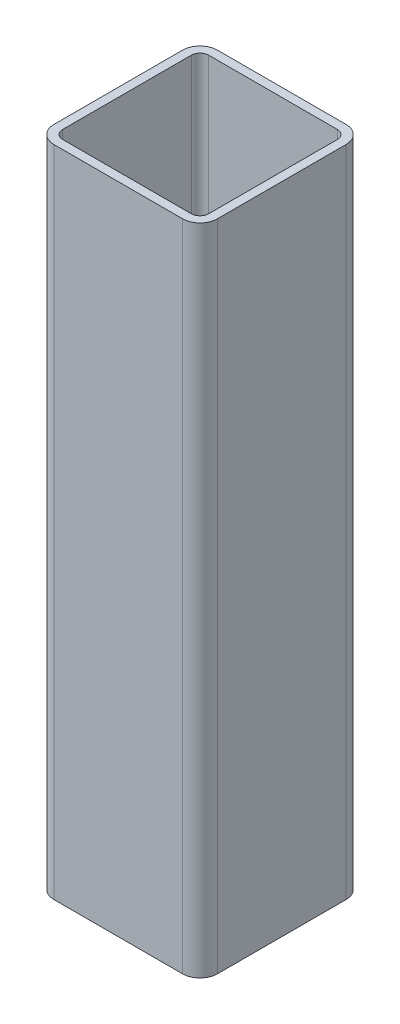
ISO-10303-21;
HEADER;
FILE_DESCRIPTION(('STEP AP214'),'2;1');
FILE_NAME('part.step','',(''),(''),'','','');
FILE_SCHEMA(('AUTOMOTIVE_DESIGN { 1 0 10303 214 1 1 1 1 }'));
ENDSEC;
DATA;
#1=APPLICATION_CONTEXT('core data for automotive mechanical design processes');
#2=APPLICATION_PROTOCOL_DEFINITION('international standard','automotive_design',2000,#1);
#3=PRODUCT_CONTEXT('',#1,'mechanical');
#4=PRODUCT('Part','Part','',(#3));
#5=PRODUCT_RELATED_PRODUCT_CATEGORY('part','',(#4));
#6=PRODUCT_DEFINITION_FORMATION('','',#4);
#7=PRODUCT_DEFINITION_CONTEXT('part definition',#1,'design');
#8=PRODUCT_DEFINITION('design','',#6,#7);
#9=PRODUCT_DEFINITION_SHAPE('','',#8);
#10=(LENGTH_UNIT() NAMED_UNIT(*) SI_UNIT(.MILLI.,.METRE.));
#11=(NAMED_UNIT(*) PLANE_ANGLE_UNIT() SI_UNIT($,.RADIAN.));
#12=(NAMED_UNIT(*) SI_UNIT($,.STERADIAN.) SOLID_ANGLE_UNIT());
#13=UNCERTAINTY_MEASURE_WITH_UNIT(LENGTH_MEASURE(1.E-05),#10,'distance_accuracy_value','');
#14=(GEOMETRIC_REPRESENTATION_CONTEXT(3) GLOBAL_UNCERTAINTY_ASSIGNED_CONTEXT((#13)) GLOBAL_UNIT_ASSIGNED_CONTEXT((#10,
#11,#12)) REPRESENTATION_CONTEXT('',''));
#15=CARTESIAN_POINT('',(0.,0.,0.));
#16=DIRECTION('',(0.,0.,1.));
#17=DIRECTION('',(1.,0.,0.));
#18=AXIS2_PLACEMENT_3D('',#15,#16,#17);
#19=CARTESIAN_POINT('',(646.4,0.,-436.8));
#20=DIRECTION('',(0.,0.,1.));
#21=DIRECTION('',(1.,0.,0.));
#22=AXIS2_PLACEMENT_3D('',#19,#20,#21);
#23=PLANE('',#22);
#24=DIRECTION('',(0.,1.,0.));
#25=VECTOR('',#24,1.);
#26=CARTESIAN_POINT('',(693.6,0.,-436.8));
#27=LINE('',#26,#25);
#28=CARTESIAN_POINT('',(693.6,30.,-436.8));
#29=VERTEX_POINT('',#28);
#30=CARTESIAN_POINT('',(693.6,270.,-436.8));
#31=VERTEX_POINT('',#30);
#32=EDGE_CURVE('E149',#29,#31,#27,.T.);
#33=ORIENTED_EDGE('',*,*,#32,.T.);
#34=DIRECTION('',(-1.,0.,0.));
#35=VECTOR('',#34,1.);
#36=CARTESIAN_POINT('',(646.4,270.,-436.8));
#37=LINE('',#36,#35);
#38=CARTESIAN_POINT('',(646.4,270.,-436.8));
#39=VERTEX_POINT('',#38);
#40=EDGE_CURVE('E181',#39,#31,#37,.F.);
#41=ORIENTED_EDGE('',*,*,#40,.F.);
#42=DIRECTION('',(0.,1.,0.));
#43=VECTOR('',#42,1.);
#44=CARTESIAN_POINT('',(646.4,0.,-436.8));
#45=LINE('',#44,#43);
#46=CARTESIAN_POINT('',(646.4,30.,-436.8));
#47=VERTEX_POINT('',#46);
#48=EDGE_CURVE('E152',#39,#47,#45,.F.);
#49=ORIENTED_EDGE('',*,*,#48,.T.);
#50=DIRECTION('',(1.,0.,0.));
#51=VECTOR('',#50,1.);
#52=CARTESIAN_POINT('',(670.,30.,-436.8));
#53=LINE('',#52,#51);
#54=EDGE_CURVE('E200',#29,#47,#53,.F.);
#55=ORIENTED_EDGE('',*,*,#54,.F.);
#56=EDGE_LOOP('',(#33,#41,#49,#55));
#57=FACE_BOUND('',#56,.T.);
#58=ADVANCED_FACE('F16',(#57),#23,.T.);
#59=CARTESIAN_POINT('',(693.6,0.,-433.6));
#60=DIRECTION('',(0.,1.,0.));
#61=DIRECTION('',(0.,0.,1.));
#62=AXIS2_PLACEMENT_3D('',#59,#60,#61);
#63=CYLINDRICAL_SURFACE('',#62,3.19999999999998);
#64=CARTESIAN_POINT('',(693.6,30.,-433.6));
#65=DIRECTION('',(0.,1.,0.));
#66=DIRECTION('',(0.,0.,1.));
#67=AXIS2_PLACEMENT_3D('',#64,#65,#66);
#68=CIRCLE('',#67,3.19999999999998);
#69=CARTESIAN_POINT('',(696.8,30.,-433.6));
#70=VERTEX_POINT('',#69);
#71=EDGE_CURVE('E115',#70,#29,#68,.T.);
#72=ORIENTED_EDGE('',*,*,#71,.F.);
#73=DIRECTION('',(0.,1.,0.));
#74=VECTOR('',#73,1.);
#75=CARTESIAN_POINT('',(696.8,0.,-433.6));
#76=LINE('',#75,#74);
#77=CARTESIAN_POINT('',(696.8,270.,-433.6));
#78=VERTEX_POINT('',#77);
#79=EDGE_CURVE('E106',#78,#70,#76,.F.);
#80=ORIENTED_EDGE('',*,*,#79,.F.);
#81=CARTESIAN_POINT('',(693.6,270.,-433.6));
#82=DIRECTION('',(0.,1.,0.));
#83=DIRECTION('',(0.,0.,1.));
#84=AXIS2_PLACEMENT_3D('',#81,#82,#83);
#85=CIRCLE('',#84,3.19999999999998);
#86=EDGE_CURVE('E178',#31,#78,#85,.F.);
#87=ORIENTED_EDGE('',*,*,#86,.F.);
#88=ORIENTED_EDGE('',*,*,#32,.F.);
#89=EDGE_LOOP('',(#72,#80,#87,#88));
#90=FACE_BOUND('',#89,.T.);
#91=ADVANCED_FACE('F275',(#90),#63,.F.);
#92=CARTESIAN_POINT('',(696.8,0.,-386.4));
#93=DIRECTION('',(-1.,0.,0.));
#94=DIRECTION('',(0.,0.,1.));
#95=AXIS2_PLACEMENT_3D('',#92,#93,#94);
#96=PLANE('',#95);
#97=DIRECTION('',(0.,1.,0.));
#98=VECTOR('',#97,1.);
#99=CARTESIAN_POINT('',(696.8,0.,-386.4));
#100=LINE('',#99,#98);
#101=CARTESIAN_POINT('',(696.8,30.,-386.4));
#102=VERTEX_POINT('',#101);
#103=CARTESIAN_POINT('',(696.8,270.,-386.4));
#104=VERTEX_POINT('',#103);
#105=EDGE_CURVE('E95',#102,#104,#100,.T.);
#106=ORIENTED_EDGE('',*,*,#105,.T.);
#107=DIRECTION('',(0.,0.,1.));
#108=VECTOR('',#107,1.);
#109=CARTESIAN_POINT('',(696.8,270.,1170.));
#110=LINE('',#109,#108);
#111=EDGE_CURVE('E177',#78,#104,#110,.T.);
#112=ORIENTED_EDGE('',*,*,#111,.F.);
#113=ORIENTED_EDGE('',*,*,#79,.T.);
#114=DIRECTION('',(0.,0.,-1.));
#115=VECTOR('',#114,1.);
#116=CARTESIAN_POINT('',(696.8,30.,-433.6));
#117=LINE('',#116,#115);
#118=EDGE_CURVE('E109',#102,#70,#117,.T.);
#119=ORIENTED_EDGE('',*,*,#118,.F.);
#120=EDGE_LOOP('',(#106,#112,#113,#119));
#121=FACE_BOUND('',#120,.T.);
#122=ADVANCED_FACE('F110',(#121),#96,.T.);
#123=CARTESIAN_POINT('',(693.6,0.,-386.4));
#124=DIRECTION('',(0.,1.,0.));
#125=DIRECTION('',(0.,0.,1.));
#126=AXIS2_PLACEMENT_3D('',#123,#124,#125);
#127=CYLINDRICAL_SURFACE('',#126,3.19999999999998);
#128=CARTESIAN_POINT('',(693.6,30.,-386.4));
#129=DIRECTION('',(0.,1.,0.));
#130=DIRECTION('',(0.,0.,1.));
#131=AXIS2_PLACEMENT_3D('',#128,#129,#130);
#132=CIRCLE('',#131,3.19999999999998);
#133=CARTESIAN_POINT('',(693.6,30.,-383.2));
#134=VERTEX_POINT('',#133);
#135=EDGE_CURVE('E19',#134,#102,#132,.T.);
#136=ORIENTED_EDGE('',*,*,#135,.F.);
#137=DIRECTION('',(0.,1.,0.));
#138=VECTOR('',#137,1.);
#139=CARTESIAN_POINT('',(693.6,0.,-383.2));
#140=LINE('',#139,#138);
#141=CARTESIAN_POINT('',(693.6,270.,-383.2));
#142=VERTEX_POINT('',#141);
#143=EDGE_CURVE('E89',#142,#134,#140,.F.);
#144=ORIENTED_EDGE('',*,*,#143,.F.);
#145=CARTESIAN_POINT('',(693.6,270.,-386.4));
#146=DIRECTION('',(0.,1.,0.));
#147=DIRECTION('',(0.,0.,1.));
#148=AXIS2_PLACEMENT_3D('',#145,#146,#147);
#149=CIRCLE('',#148,3.19999999999998);
#150=EDGE_CURVE('E102',#104,#142,#149,.F.);
#151=ORIENTED_EDGE('',*,*,#150,.F.);
#152=ORIENTED_EDGE('',*,*,#105,.F.);
#153=EDGE_LOOP('',(#136,#144,#151,#152));
#154=FACE_BOUND('',#153,.T.);
#155=ADVANCED_FACE('F97',(#154),#127,.F.);
#156=CARTESIAN_POINT('',(693.6,0.,-383.2));
#157=DIRECTION('',(0.,0.,-1.));
#158=DIRECTION('',(-1.,0.,0.));
#159=AXIS2_PLACEMENT_3D('',#156,#157,#158);
#160=PLANE('',#159);
#161=DIRECTION('',(0.,1.,0.));
#162=VECTOR('',#161,1.);
#163=CARTESIAN_POINT('',(646.4,0.,-383.2));
#164=LINE('',#163,#162);
#165=CARTESIAN_POINT('',(646.4,30.,-383.2));
#166=VERTEX_POINT('',#165);
#167=CARTESIAN_POINT('',(646.4,270.,-383.2));
#168=VERTEX_POINT('',#167);
#169=EDGE_CURVE('E121',#166,#168,#164,.T.);
#170=ORIENTED_EDGE('',*,*,#169,.T.);
#171=DIRECTION('',(-1.,0.,0.));
#172=VECTOR('',#171,1.);
#173=CARTESIAN_POINT('',(646.4,270.,-383.2));
#174=LINE('',#173,#172);
#175=EDGE_CURVE('E175',#142,#168,#174,.T.);
#176=ORIENTED_EDGE('',*,*,#175,.F.);
#177=ORIENTED_EDGE('',*,*,#143,.T.);
#178=DIRECTION('',(1.,0.,0.));
#179=VECTOR('',#178,1.);
#180=CARTESIAN_POINT('',(670.,30.,-383.2));
#181=LINE('',#180,#179);
#182=EDGE_CURVE('E120',#166,#134,#181,.T.);
#183=ORIENTED_EDGE('',*,*,#182,.F.);
#184=EDGE_LOOP('',(#170,#176,#177,#183));
#185=FACE_BOUND('',#184,.T.);
#186=ADVANCED_FACE('F283',(#185),#160,.T.);
#187=CARTESIAN_POINT('',(693.6,0.,-386.4));
#188=DIRECTION('',(0.,1.,0.));
#189=DIRECTION('',(0.,0.,1.));
#190=AXIS2_PLACEMENT_3D('',#187,#188,#189);
#191=CYLINDRICAL_SURFACE('',#190,6.40000000000002);
#192=CARTESIAN_POINT('',(693.6,270.,-386.4));
#193=DIRECTION('',(0.,1.,0.));
#194=DIRECTION('',(0.,0.,1.));
#195=AXIS2_PLACEMENT_3D('',#192,#193,#194);
#196=CIRCLE('',#195,6.40000000000002);
#197=CARTESIAN_POINT('',(693.6,270.,-380.));
#198=VERTEX_POINT('',#197);
#199=CARTESIAN_POINT('',(700.,270.,-386.4));
#200=VERTEX_POINT('',#199);
#201=EDGE_CURVE('E169',#198,#200,#196,.T.);
#202=ORIENTED_EDGE('',*,*,#201,.F.);
#203=DIRECTION('',(0.,1.,0.));
#204=VECTOR('',#203,1.);
#205=CARTESIAN_POINT('',(693.6,0.,-380.));
#206=LINE('',#205,#204);
#207=CARTESIAN_POINT('',(693.6,30.,-380.));
#208=VERTEX_POINT('',#207);
#209=EDGE_CURVE('E124',#198,#208,#206,.F.);
#210=ORIENTED_EDGE('',*,*,#209,.T.);
#211=CARTESIAN_POINT('',(693.6,30.,-386.4));
#212=DIRECTION('',(0.,1.,0.));
#213=DIRECTION('',(0.,0.,1.));
#214=AXIS2_PLACEMENT_3D('',#211,#212,#213);
#215=CIRCLE('',#214,6.40000000000002);
#216=CARTESIAN_POINT('',(700.,30.,-386.4));
#217=VERTEX_POINT('',#216);
#218=EDGE_CURVE('E184',#217,#208,#215,.F.);
#219=ORIENTED_EDGE('',*,*,#218,.F.);
#220=DIRECTION('',(0.,1.,0.));
#221=VECTOR('',#220,1.);
#222=CARTESIAN_POINT('',(700.,0.,-386.4));
#223=LINE('',#222,#221);
#224=EDGE_CURVE('E144',#217,#200,#223,.T.);
#225=ORIENTED_EDGE('',*,*,#224,.T.);
#226=EDGE_LOOP('',(#202,#210,#219,#225));
#227=FACE_BOUND('',#226,.T.);
#228=ADVANCED_FACE('F285',(#227),#191,.T.);
#229=CARTESIAN_POINT('',(700.,0.,-386.4));
#230=DIRECTION('',(-1.,0.,0.));
#231=DIRECTION('',(0.,0.,1.));
#232=AXIS2_PLACEMENT_3D('',#229,#230,#231);
#233=PLANE('',#232);
#234=DIRECTION('',(0.,1.,0.));
#235=VECTOR('',#234,1.);
#236=CARTESIAN_POINT('',(700.,0.,-433.6));
#237=LINE('',#236,#235);
#238=CARTESIAN_POINT('',(700.,270.,-433.6));
#239=VERTEX_POINT('',#238);
#240=CARTESIAN_POINT('',(700.,30.,-433.6));
#241=VERTEX_POINT('',#240);
#242=EDGE_CURVE('E142',#239,#241,#237,.F.);
#243=ORIENTED_EDGE('',*,*,#242,.F.);
#244=DIRECTION('',(0.,0.,1.));
#245=VECTOR('',#244,1.);
#246=CARTESIAN_POINT('',(700.,270.,1170.));
#247=LINE('',#246,#245);
#248=EDGE_CURVE('E168',#200,#239,#247,.F.);
#249=ORIENTED_EDGE('',*,*,#248,.F.);
#250=ORIENTED_EDGE('',*,*,#224,.F.);
#251=DIRECTION('',(0.,0.,-1.));
#252=VECTOR('',#251,1.);
#253=CARTESIAN_POINT('',(700.,30.,-433.6));
#254=LINE('',#253,#252);
#255=EDGE_CURVE('E187',#241,#217,#254,.F.);
#256=ORIENTED_EDGE('',*,*,#255,.F.);
#257=EDGE_LOOP('',(#243,#249,#250,#256));
#258=FACE_BOUND('',#257,.T.);
#259=ADVANCED_FACE('F292',(#258),#233,.F.);
#260=CARTESIAN_POINT('',(693.6,0.,-433.6));
#261=DIRECTION('',(0.,1.,0.));
#262=DIRECTION('',(0.,0.,1.));
#263=AXIS2_PLACEMENT_3D('',#260,#261,#262);
#264=CYLINDRICAL_SURFACE('',#263,6.40000000000002);
#265=CARTESIAN_POINT('',(693.6,270.,-433.6));
#266=DIRECTION('',(0.,1.,0.));
#267=DIRECTION('',(0.,0.,1.));
#268=AXIS2_PLACEMENT_3D('',#265,#266,#267);
#269=CIRCLE('',#268,6.40000000000002);
#270=CARTESIAN_POINT('',(693.6,270.,-440.));
#271=VERTEX_POINT('',#270);
#272=EDGE_CURVE('E165',#239,#271,#269,.T.);
#273=ORIENTED_EDGE('',*,*,#272,.F.);
#274=ORIENTED_EDGE('',*,*,#242,.T.);
#275=CARTESIAN_POINT('',(693.6,30.,-433.6));
#276=DIRECTION('',(0.,1.,0.));
#277=DIRECTION('',(0.,0.,1.));
#278=AXIS2_PLACEMENT_3D('',#275,#276,#277);
#279=CIRCLE('',#278,6.40000000000002);
#280=CARTESIAN_POINT('',(693.6,30.,-440.));
#281=VERTEX_POINT('',#280);
#282=EDGE_CURVE('E188',#281,#241,#279,.F.);
#283=ORIENTED_EDGE('',*,*,#282,.F.);
#284=DIRECTION('',(0.,1.,0.));
#285=VECTOR('',#284,1.);
#286=CARTESIAN_POINT('',(693.6,0.,-440.));
#287=LINE('',#286,#285);
#288=EDGE_CURVE('E139',#281,#271,#287,.T.);
#289=ORIENTED_EDGE('',*,*,#288,.T.);
#290=EDGE_LOOP('',(#273,#274,#283,#289));
#291=FACE_BOUND('',#290,.T.);
#292=ADVANCED_FACE('F326',(#291),#264,.T.);
#293=CARTESIAN_POINT('',(646.4,0.,-440.));
#294=DIRECTION('',(0.,0.,1.));
#295=DIRECTION('',(1.,0.,0.));
#296=AXIS2_PLACEMENT_3D('',#293,#294,#295);
#297=PLANE('',#296);
#298=DIRECTION('',(0.,1.,0.));
#299=VECTOR('',#298,1.);
#300=CARTESIAN_POINT('',(646.4,0.,-440.));
#301=LINE('',#300,#299);
#302=CARTESIAN_POINT('',(646.4,270.,-440.));
#303=VERTEX_POINT('',#302);
#304=CARTESIAN_POINT('',(646.4,30.,-440.));
#305=VERTEX_POINT('',#304);
#306=EDGE_CURVE('E137',#303,#305,#301,.F.);
#307=ORIENTED_EDGE('',*,*,#306,.F.);
#308=DIRECTION('',(-1.,0.,0.));
#309=VECTOR('',#308,1.);
#310=CARTESIAN_POINT('',(646.4,270.,-440.));
#311=LINE('',#310,#309);
#312=EDGE_CURVE('E164',#271,#303,#311,.T.);
#313=ORIENTED_EDGE('',*,*,#312,.F.);
#314=ORIENTED_EDGE('',*,*,#288,.F.);
#315=DIRECTION('',(1.,0.,0.));
#316=VECTOR('',#315,1.);
#317=CARTESIAN_POINT('',(670.,30.,-440.));
#318=LINE('',#317,#316);
#319=EDGE_CURVE('E191',#305,#281,#318,.T.);
#320=ORIENTED_EDGE('',*,*,#319,.F.);
#321=EDGE_LOOP('',(#307,#313,#314,#320));
#322=FACE_BOUND('',#321,.T.);
#323=ADVANCED_FACE('F322',(#322),#297,.F.);
#324=CARTESIAN_POINT('',(646.4,0.,-433.6));
#325=DIRECTION('',(0.,1.,0.));
#326=DIRECTION('',(0.,0.,1.));
#327=AXIS2_PLACEMENT_3D('',#324,#325,#326);
#328=CYLINDRICAL_SURFACE('',#327,6.40000000000002);
#329=CARTESIAN_POINT('',(646.4,270.,-433.6));
#330=DIRECTION('',(0.,1.,0.));
#331=DIRECTION('',(0.,0.,1.));
#332=AXIS2_PLACEMENT_3D('',#329,#330,#331);
#333=CIRCLE('',#332,6.40000000000002);
#334=CARTESIAN_POINT('',(640.,270.,-433.6));
#335=VERTEX_POINT('',#334);
#336=EDGE_CURVE('E161',#303,#335,#333,.T.);
#337=ORIENTED_EDGE('',*,*,#336,.F.);
#338=ORIENTED_EDGE('',*,*,#306,.T.);
#339=CARTESIAN_POINT('',(646.4,30.,-433.6));
#340=DIRECTION('',(0.,1.,0.));
#341=DIRECTION('',(0.,0.,1.));
#342=AXIS2_PLACEMENT_3D('',#339,#340,#341);
#343=CIRCLE('',#342,6.40000000000002);
#344=CARTESIAN_POINT('',(640.,30.,-433.6));
#345=VERTEX_POINT('',#344);
#346=EDGE_CURVE('E192',#345,#305,#343,.F.);
#347=ORIENTED_EDGE('',*,*,#346,.F.);
#348=DIRECTION('',(0.,1.,0.));
#349=VECTOR('',#348,1.);
#350=CARTESIAN_POINT('',(640.,0.,-433.6));
#351=LINE('',#350,#349);
#352=EDGE_CURVE('E134',#345,#335,#351,.T.);
#353=ORIENTED_EDGE('',*,*,#352,.T.);
#354=EDGE_LOOP('',(#337,#338,#347,#353));
#355=FACE_BOUND('',#354,.T.);
#356=ADVANCED_FACE('F318',(#355),#328,.T.);
#357=CARTESIAN_POINT('',(640.,0.,-433.6));
#358=DIRECTION('',(1.,0.,0.));
#359=DIRECTION('',(0.,0.,-1.));
#360=AXIS2_PLACEMENT_3D('',#357,#358,#359);
#361=PLANE('',#360);
#362=DIRECTION('',(0.,1.,0.));
#363=VECTOR('',#362,1.);
#364=CARTESIAN_POINT('',(640.,0.,-386.4));
#365=LINE('',#364,#363);
#366=CARTESIAN_POINT('',(640.,270.,-386.4));
#367=VERTEX_POINT('',#366);
#368=CARTESIAN_POINT('',(640.,30.,-386.4));
#369=VERTEX_POINT('',#368);
#370=EDGE_CURVE('E131',#367,#369,#365,.F.);
#371=ORIENTED_EDGE('',*,*,#370,.F.);
#372=DIRECTION('',(0.,0.,1.));
#373=VECTOR('',#372,1.);
#374=CARTESIAN_POINT('',(640.,270.,1170.));
#375=LINE('',#374,#373);
#376=EDGE_CURVE('E160',#335,#367,#375,.T.);
#377=ORIENTED_EDGE('',*,*,#376,.F.);
#378=ORIENTED_EDGE('',*,*,#352,.F.);
#379=DIRECTION('',(0.,0.,-1.));
#380=VECTOR('',#379,1.);
#381=CARTESIAN_POINT('',(640.,30.,-433.6));
#382=LINE('',#381,#380);
#383=EDGE_CURVE('E195',#369,#345,#382,.T.);
#384=ORIENTED_EDGE('',*,*,#383,.F.);
#385=EDGE_LOOP('',(#371,#377,#378,#384));
#386=FACE_BOUND('',#385,.T.);
#387=ADVANCED_FACE('F315',(#386),#361,.F.);
#388=CARTESIAN_POINT('',(646.4,0.,-386.4));
#389=DIRECTION('',(0.,1.,0.));
#390=DIRECTION('',(0.,0.,1.));
#391=AXIS2_PLACEMENT_3D('',#388,#389,#390);
#392=CYLINDRICAL_SURFACE('',#391,6.40000000000002);
#393=CARTESIAN_POINT('',(646.4,270.,-386.4));
#394=DIRECTION('',(0.,1.,0.));
#395=DIRECTION('',(0.,0.,1.));
#396=AXIS2_PLACEMENT_3D('',#393,#394,#395);
#397=CIRCLE('',#396,6.40000000000002);
#398=CARTESIAN_POINT('',(646.4,270.,-380.));
#399=VERTEX_POINT('',#398);
#400=EDGE_CURVE('E156',#367,#399,#397,.T.);
#401=ORIENTED_EDGE('',*,*,#400,.F.);
#402=ORIENTED_EDGE('',*,*,#370,.T.);
#403=CARTESIAN_POINT('',(646.4,30.,-386.4));
#404=DIRECTION('',(0.,1.,0.));
#405=DIRECTION('',(0.,0.,1.));
#406=AXIS2_PLACEMENT_3D('',#403,#404,#405);
#407=CIRCLE('',#406,6.40000000000002);
#408=CARTESIAN_POINT('',(646.4,30.,-380.));
#409=VERTEX_POINT('',#408);
#410=EDGE_CURVE('E196',#409,#369,#407,.F.);
#411=ORIENTED_EDGE('',*,*,#410,.F.);
#412=DIRECTION('',(0.,1.,0.));
#413=VECTOR('',#412,1.);
#414=CARTESIAN_POINT('',(646.4,0.,-380.));
#415=LINE('',#414,#413);
#416=EDGE_CURVE('E128',#409,#399,#415,.T.);
#417=ORIENTED_EDGE('',*,*,#416,.T.);
#418=EDGE_LOOP('',(#401,#402,#411,#417));
#419=FACE_BOUND('',#418,.T.);
#420=ADVANCED_FACE('F312',(#419),#392,.T.);
#421=CARTESIAN_POINT('',(693.6,0.,-380.));
#422=DIRECTION('',(0.,0.,-1.));
#423=DIRECTION('',(-1.,0.,0.));
#424=AXIS2_PLACEMENT_3D('',#421,#422,#423);
#425=PLANE('',#424);
#426=ORIENTED_EDGE('',*,*,#209,.F.);
#427=DIRECTION('',(-1.,0.,0.));
#428=VECTOR('',#427,1.);
#429=CARTESIAN_POINT('',(646.4,270.,-380.));
#430=LINE('',#429,#428);
#431=EDGE_CURVE('E159',#399,#198,#430,.F.);
#432=ORIENTED_EDGE('',*,*,#431,.F.);
#433=ORIENTED_EDGE('',*,*,#416,.F.);
#434=DIRECTION('',(1.,0.,0.));
#435=VECTOR('',#434,1.);
#436=CARTESIAN_POINT('',(670.,30.,-380.));
#437=LINE('',#436,#435);
#438=EDGE_CURVE('E155',#208,#409,#437,.F.);
#439=ORIENTED_EDGE('',*,*,#438,.F.);
#440=EDGE_LOOP('',(#426,#432,#433,#439));
#441=FACE_BOUND('',#440,.T.);
#442=ADVANCED_FACE('F247',(#441),#425,.F.);
#443=CARTESIAN_POINT('',(646.4,0.,-386.4));
#444=DIRECTION('',(0.,1.,0.));
#445=DIRECTION('',(0.,0.,1.));
#446=AXIS2_PLACEMENT_3D('',#443,#444,#445);
#447=CYLINDRICAL_SURFACE('',#446,3.19999999999998);
#448=CARTESIAN_POINT('',(646.4,30.,-386.4));
#449=DIRECTION('',(0.,1.,0.));
#450=DIRECTION('',(0.,0.,1.));
#451=AXIS2_PLACEMENT_3D('',#448,#449,#450);
#452=CIRCLE('',#451,3.19999999999998);
#453=CARTESIAN_POINT('',(643.2,30.,-386.4));
#454=VERTEX_POINT('',#453);
#455=EDGE_CURVE('E199',#454,#166,#452,.T.);
#456=ORIENTED_EDGE('',*,*,#455,.F.);
#457=DIRECTION('',(0.,1.,0.));
#458=VECTOR('',#457,1.);
#459=CARTESIAN_POINT('',(643.2,0.,-386.4));
#460=LINE('',#459,#458);
#461=CARTESIAN_POINT('',(643.2,270.,-386.4));
#462=VERTEX_POINT('',#461);
#463=EDGE_CURVE('E216',#462,#454,#460,.F.);
#464=ORIENTED_EDGE('',*,*,#463,.F.);
#465=CARTESIAN_POINT('',(646.4,270.,-386.4));
#466=DIRECTION('',(0.,1.,0.));
#467=DIRECTION('',(0.,0.,1.));
#468=AXIS2_PLACEMENT_3D('',#465,#466,#467);
#469=CIRCLE('',#468,3.19999999999998);
#470=EDGE_CURVE('E172',#168,#462,#469,.F.);
#471=ORIENTED_EDGE('',*,*,#470,.F.);
#472=ORIENTED_EDGE('',*,*,#169,.F.);
#473=EDGE_LOOP('',(#456,#464,#471,#472));
#474=FACE_BOUND('',#473,.T.);
#475=ADVANCED_FACE('F281',(#474),#447,.F.);
#476=CARTESIAN_POINT('',(670.,30.,-433.6));
#477=DIRECTION('',(0.,-1.,0.));
#478=DIRECTION('',(0.,0.,-1.));
#479=AXIS2_PLACEMENT_3D('',#476,#477,#478);
#480=PLANE('',#479);
#481=ORIENTED_EDGE('',*,*,#218,.T.);
#482=ORIENTED_EDGE('',*,*,#438,.T.);
#483=ORIENTED_EDGE('',*,*,#410,.T.);
#484=ORIENTED_EDGE('',*,*,#383,.T.);
#485=ORIENTED_EDGE('',*,*,#346,.T.);
#486=ORIENTED_EDGE('',*,*,#319,.T.);
#487=ORIENTED_EDGE('',*,*,#282,.T.);
#488=ORIENTED_EDGE('',*,*,#255,.T.);
#489=EDGE_LOOP('',(#481,#482,#483,#484,#485,#486,#487,#488));
#490=FACE_BOUND('',#489,.T.);
#491=DIRECTION('',(0.,0.,-1.));
#492=VECTOR('',#491,1.);
#493=CARTESIAN_POINT('',(643.2,30.,-433.6));
#494=LINE('',#493,#492);
#495=CARTESIAN_POINT('',(643.2,30.,-433.6));
#496=VERTEX_POINT('',#495);
#497=EDGE_CURVE('E213',#454,#496,#494,.T.);
#498=ORIENTED_EDGE('',*,*,#497,.F.);
#499=ORIENTED_EDGE('',*,*,#455,.T.);
#500=ORIENTED_EDGE('',*,*,#182,.T.);
#501=ORIENTED_EDGE('',*,*,#135,.T.);
#502=ORIENTED_EDGE('',*,*,#118,.T.);
#503=ORIENTED_EDGE('',*,*,#71,.T.);
#504=ORIENTED_EDGE('',*,*,#54,.T.);
#505=CARTESIAN_POINT('',(646.4,30.,-433.6));
#506=DIRECTION('',(0.,1.,0.));
#507=DIRECTION('',(0.,0.,1.));
#508=AXIS2_PLACEMENT_3D('',#505,#506,#507);
#509=CIRCLE('',#508,3.19999999999993);
#510=EDGE_CURVE('E154',#47,#496,#509,.T.);
#511=ORIENTED_EDGE('',*,*,#510,.T.);
#512=EDGE_LOOP('',(#498,#499,#500,#501,#502,#503,#504,#511));
#513=FACE_BOUND('',#512,.T.);
#514=ADVANCED_FACE('F118',(#490,#513),#480,.T.);
#515=CARTESIAN_POINT('',(646.4,0.,-433.6));
#516=DIRECTION('',(0.,1.,0.));
#517=DIRECTION('',(0.,0.,1.));
#518=AXIS2_PLACEMENT_3D('',#515,#516,#517);
#519=CYLINDRICAL_SURFACE('',#518,3.19999999999993);
#520=ORIENTED_EDGE('',*,*,#510,.F.);
#521=ORIENTED_EDGE('',*,*,#48,.F.);
#522=CARTESIAN_POINT('',(646.4,270.,-433.6));
#523=DIRECTION('',(0.,1.,0.));
#524=DIRECTION('',(0.,0.,1.));
#525=AXIS2_PLACEMENT_3D('',#522,#523,#524);
#526=CIRCLE('',#525,3.19999999999993);
#527=CARTESIAN_POINT('',(643.2,270.,-433.6));
#528=VERTEX_POINT('',#527);
#529=EDGE_CURVE('E34',#528,#39,#526,.F.);
#530=ORIENTED_EDGE('',*,*,#529,.F.);
#531=DIRECTION('',(0.,1.,0.));
#532=VECTOR('',#531,1.);
#533=CARTESIAN_POINT('',(643.2,0.,-433.6));
#534=LINE('',#533,#532);
#535=EDGE_CURVE('E25',#496,#528,#534,.T.);
#536=ORIENTED_EDGE('',*,*,#535,.F.);
#537=EDGE_LOOP('',(#520,#521,#530,#536));
#538=FACE_BOUND('',#537,.T.);
#539=ADVANCED_FACE('F276',(#538),#519,.F.);
#540=CARTESIAN_POINT('',(646.4,270.,1170.));
#541=DIRECTION('',(0.,1.,0.));
#542=DIRECTION('',(-1.,0.,0.));
#543=AXIS2_PLACEMENT_3D('',#540,#541,#542);
#544=PLANE('',#543);
#545=ORIENTED_EDGE('',*,*,#400,.T.);
#546=ORIENTED_EDGE('',*,*,#431,.T.);
#547=ORIENTED_EDGE('',*,*,#201,.T.);
#548=ORIENTED_EDGE('',*,*,#248,.T.);
#549=ORIENTED_EDGE('',*,*,#272,.T.);
#550=ORIENTED_EDGE('',*,*,#312,.T.);
#551=ORIENTED_EDGE('',*,*,#336,.T.);
#552=ORIENTED_EDGE('',*,*,#376,.T.);
#553=EDGE_LOOP('',(#545,#546,#547,#548,#549,#550,#551,#552));
#554=FACE_BOUND('',#553,.T.);
#555=ORIENTED_EDGE('',*,*,#175,.T.);
#556=ORIENTED_EDGE('',*,*,#470,.T.);
#557=DIRECTION('',(0.,0.,-1.));
#558=VECTOR('',#557,1.);
#559=CARTESIAN_POINT('',(643.2,270.,-433.6));
#560=LINE('',#559,#558);
#561=EDGE_CURVE('E11',#528,#462,#560,.F.);
#562=ORIENTED_EDGE('',*,*,#561,.F.);
#563=ORIENTED_EDGE('',*,*,#529,.T.);
#564=ORIENTED_EDGE('',*,*,#40,.T.);
#565=ORIENTED_EDGE('',*,*,#86,.T.);
#566=ORIENTED_EDGE('',*,*,#111,.T.);
#567=ORIENTED_EDGE('',*,*,#150,.T.);
#568=EDGE_LOOP('',(#555,#556,#562,#563,#564,#565,#566,#567));
#569=FACE_BOUND('',#568,.T.);
#570=ADVANCED_FACE('F236',(#554,#569),#544,.T.);
#571=CARTESIAN_POINT('',(643.2,0.,-433.6));
#572=DIRECTION('',(1.,0.,0.));
#573=DIRECTION('',(0.,0.,-1.));
#574=AXIS2_PLACEMENT_3D('',#571,#572,#573);
#575=PLANE('',#574);
#576=ORIENTED_EDGE('',*,*,#535,.T.);
#577=ORIENTED_EDGE('',*,*,#561,.T.);
#578=ORIENTED_EDGE('',*,*,#463,.T.);
#579=ORIENTED_EDGE('',*,*,#497,.T.);
#580=EDGE_LOOP('',(#576,#577,#578,#579));
#581=FACE_BOUND('',#580,.T.);
#582=ADVANCED_FACE('F278',(#581),#575,.T.);
#583=CLOSED_SHELL('',(#58,#91,#122,#155,#186,#228,#259,#292,#323,#356,#387,#420,#442,#475,#514,
#539,#570,#582));
#584=MANIFOLD_SOLID_BREP('B1',#583);
#585=ADVANCED_BREP_SHAPE_REPRESENTATION('',(#18,#584),#14);
#586=SHAPE_DEFINITION_REPRESENTATION(#9,#585);
ENDSEC;
END-ISO-10303-21;
